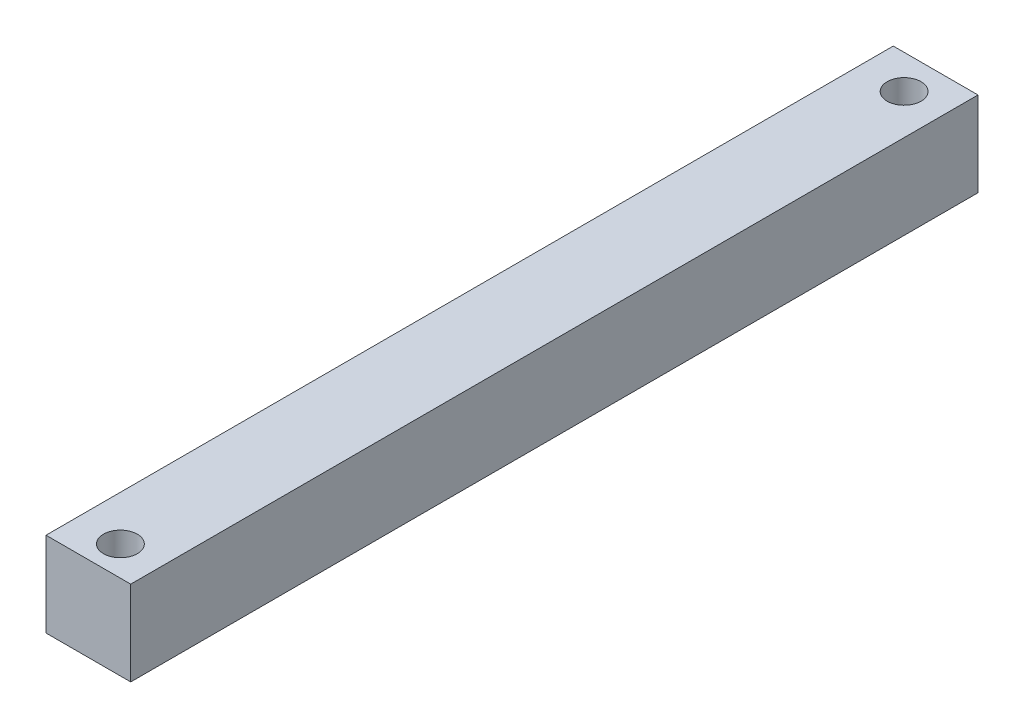
ISO-10303-21;
HEADER;
FILE_DESCRIPTION(('STEP AP214'),'2;1');
FILE_NAME('part.step','',(''),(''),'','','');
FILE_SCHEMA(('AUTOMOTIVE_DESIGN { 1 0 10303 214 1 1 1 1 }'));
ENDSEC;
DATA;
#1=APPLICATION_CONTEXT('core data for automotive mechanical design processes');
#2=APPLICATION_PROTOCOL_DEFINITION('international standard','automotive_design',2000,#1);
#3=PRODUCT_CONTEXT('',#1,'mechanical');
#4=PRODUCT('Part','Part','',(#3));
#5=PRODUCT_RELATED_PRODUCT_CATEGORY('part','',(#4));
#6=PRODUCT_DEFINITION_FORMATION('','',#4);
#7=PRODUCT_DEFINITION_CONTEXT('part definition',#1,'design');
#8=PRODUCT_DEFINITION('design','',#6,#7);
#9=PRODUCT_DEFINITION_SHAPE('','',#8);
#10=(LENGTH_UNIT() NAMED_UNIT(*) SI_UNIT(.MILLI.,.METRE.));
#11=(NAMED_UNIT(*) PLANE_ANGLE_UNIT() SI_UNIT($,.RADIAN.));
#12=(NAMED_UNIT(*) SI_UNIT($,.STERADIAN.) SOLID_ANGLE_UNIT());
#13=UNCERTAINTY_MEASURE_WITH_UNIT(LENGTH_MEASURE(1.E-05),#10,'distance_accuracy_value','');
#14=(GEOMETRIC_REPRESENTATION_CONTEXT(3) GLOBAL_UNCERTAINTY_ASSIGNED_CONTEXT((#13)) GLOBAL_UNIT_ASSIGNED_CONTEXT((#10,
#11,#12)) REPRESENTATION_CONTEXT('',''));
#15=CARTESIAN_POINT('',(0.,0.,0.));
#16=DIRECTION('',(0.,0.,1.));
#17=DIRECTION('',(1.,0.,0.));
#18=AXIS2_PLACEMENT_3D('',#15,#16,#17);
#19=CARTESIAN_POINT('',(-1.09957761847415,10.,-34.6601456924102));
#20=DIRECTION('',(1.,0.,0.));
#21=DIRECTION('',(0.,0.,-1.));
#22=AXIS2_PLACEMENT_3D('',#19,#20,#21);
#23=PLANE('',#22);
#24=DIRECTION('',(0.,0.,1.));
#25=VECTOR('',#24,1.);
#26=CARTESIAN_POINT('',(-1.09957761847415,0.,-34.6601456924102));
#27=LINE('',#26,#25);
#28=CARTESIAN_POINT('',(-1.09957761847415,0.,-34.6601456924102));
#29=VERTEX_POINT('',#28);
#30=CARTESIAN_POINT('',(-1.09957761847413,0.,65.3398543075898));
#31=VERTEX_POINT('',#30);
#32=EDGE_CURVE('E96',#29,#31,#27,.T.);
#33=ORIENTED_EDGE('',*,*,#32,.T.);
#34=DIRECTION('',(0.,-1.,0.));
#35=VECTOR('',#34,1.);
#36=CARTESIAN_POINT('',(-1.09957761847413,10.,65.3398543075898));
#37=LINE('',#36,#35);
#38=CARTESIAN_POINT('',(-1.09957761847413,10.,65.3398543075898));
#39=VERTEX_POINT('',#38);
#40=EDGE_CURVE('E11',#39,#31,#37,.T.);
#41=ORIENTED_EDGE('',*,*,#40,.F.);
#42=DIRECTION('',(0.,0.,1.));
#43=VECTOR('',#42,1.);
#44=CARTESIAN_POINT('',(-1.09957761847415,10.,-34.6601456924102));
#45=LINE('',#44,#43);
#46=CARTESIAN_POINT('',(-1.09957761847415,10.,-34.6601456924102));
#47=VERTEX_POINT('',#46);
#48=EDGE_CURVE('E84',#47,#39,#45,.T.);
#49=ORIENTED_EDGE('',*,*,#48,.F.);
#50=DIRECTION('',(0.,-1.,0.));
#51=VECTOR('',#50,1.);
#52=CARTESIAN_POINT('',(-1.09957761847415,10.,-34.6601456924102));
#53=LINE('',#52,#51);
#54=EDGE_CURVE('E92',#47,#29,#53,.T.);
#55=ORIENTED_EDGE('',*,*,#54,.T.);
#56=EDGE_LOOP('',(#33,#41,#49,#55));
#57=FACE_BOUND('',#56,.T.);
#58=ADVANCED_FACE('F33',(#57),#23,.F.);
#59=CARTESIAN_POINT('',(-1.09957761847413,10.,65.3398543075898));
#60=DIRECTION('',(0.,0.,-1.));
#61=DIRECTION('',(-1.,0.,0.));
#62=AXIS2_PLACEMENT_3D('',#59,#60,#61);
#63=PLANE('',#62);
#64=DIRECTION('',(1.,0.,0.));
#65=VECTOR('',#64,1.);
#66=CARTESIAN_POINT('',(-1.09957761847413,0.,65.3398543075898));
#67=LINE('',#66,#65);
#68=CARTESIAN_POINT('',(8.90042238152585,0.,65.3398543075898));
#69=VERTEX_POINT('',#68);
#70=EDGE_CURVE('E88',#31,#69,#67,.T.);
#71=ORIENTED_EDGE('',*,*,#70,.T.);
#72=DIRECTION('',(0.,-1.,0.));
#73=VECTOR('',#72,1.);
#74=CARTESIAN_POINT('',(8.90042238152585,10.,65.3398543075898));
#75=LINE('',#74,#73);
#76=CARTESIAN_POINT('',(8.90042238152585,10.,65.3398543075898));
#77=VERTEX_POINT('',#76);
#78=EDGE_CURVE('E41',#77,#69,#75,.T.);
#79=ORIENTED_EDGE('',*,*,#78,.F.);
#80=DIRECTION('',(1.,0.,0.));
#81=VECTOR('',#80,1.);
#82=CARTESIAN_POINT('',(-1.09957761847413,10.,65.3398543075898));
#83=LINE('',#82,#81);
#84=EDGE_CURVE('E79',#39,#77,#83,.T.);
#85=ORIENTED_EDGE('',*,*,#84,.F.);
#86=ORIENTED_EDGE('',*,*,#40,.T.);
#87=EDGE_LOOP('',(#71,#79,#85,#86));
#88=FACE_BOUND('',#87,.T.);
#89=ADVANCED_FACE('F87',(#88),#63,.F.);
#90=CARTESIAN_POINT('',(8.90042238152585,10.,-34.6601456924102));
#91=DIRECTION('',(-1.,0.,0.));
#92=DIRECTION('',(0.,0.,1.));
#93=AXIS2_PLACEMENT_3D('',#90,#91,#92);
#94=PLANE('',#93);
#95=DIRECTION('',(0.,0.,-1.));
#96=VECTOR('',#95,1.);
#97=CARTESIAN_POINT('',(8.90042238152585,0.,-34.6601456924102));
#98=LINE('',#97,#96);
#99=CARTESIAN_POINT('',(8.90042238152585,0.,-34.6601456924102));
#100=VERTEX_POINT('',#99);
#101=EDGE_CURVE('E66',#69,#100,#98,.T.);
#102=ORIENTED_EDGE('',*,*,#101,.T.);
#103=DIRECTION('',(0.,-1.,0.));
#104=VECTOR('',#103,1.);
#105=CARTESIAN_POINT('',(8.90042238152585,10.,-34.6601456924102));
#106=LINE('',#105,#104);
#107=CARTESIAN_POINT('',(8.90042238152585,10.,-34.6601456924102));
#108=VERTEX_POINT('',#107);
#109=EDGE_CURVE('E89',#108,#100,#106,.T.);
#110=ORIENTED_EDGE('',*,*,#109,.F.);
#111=DIRECTION('',(0.,0.,-1.));
#112=VECTOR('',#111,1.);
#113=CARTESIAN_POINT('',(8.90042238152585,10.,-34.6601456924102));
#114=LINE('',#113,#112);
#115=EDGE_CURVE('E82',#77,#108,#114,.T.);
#116=ORIENTED_EDGE('',*,*,#115,.F.);
#117=ORIENTED_EDGE('',*,*,#78,.T.);
#118=EDGE_LOOP('',(#102,#110,#116,#117));
#119=FACE_BOUND('',#118,.T.);
#120=ADVANCED_FACE('F90',(#119),#94,.F.);
#121=CARTESIAN_POINT('',(-1.09957761847415,10.,-34.6601456924102));
#122=DIRECTION('',(0.,0.,1.));
#123=DIRECTION('',(1.,0.,0.));
#124=AXIS2_PLACEMENT_3D('',#121,#122,#123);
#125=PLANE('',#124);
#126=DIRECTION('',(-1.,0.,0.));
#127=VECTOR('',#126,1.);
#128=CARTESIAN_POINT('',(-1.09957761847415,0.,-34.6601456924102));
#129=LINE('',#128,#127);
#130=EDGE_CURVE('E72',#100,#29,#129,.T.);
#131=ORIENTED_EDGE('',*,*,#130,.T.);
#132=ORIENTED_EDGE('',*,*,#54,.F.);
#133=DIRECTION('',(-1.,0.,0.));
#134=VECTOR('',#133,1.);
#135=CARTESIAN_POINT('',(-1.09957761847415,10.,-34.6601456924102));
#136=LINE('',#135,#134);
#137=EDGE_CURVE('E49',#108,#47,#136,.T.);
#138=ORIENTED_EDGE('',*,*,#137,.F.);
#139=ORIENTED_EDGE('',*,*,#109,.T.);
#140=EDGE_LOOP('',(#131,#132,#138,#139));
#141=FACE_BOUND('',#140,.T.);
#142=ADVANCED_FACE('F104',(#141),#125,.F.);
#143=CARTESIAN_POINT('',(0.,10.,0.));
#144=DIRECTION('',(0.,1.,0.));
#145=DIRECTION('',(0.,0.,1.));
#146=AXIS2_PLACEMENT_3D('',#143,#144,#145);
#147=PLANE('',#146);
#148=CARTESIAN_POINT('',(4.18133562493495,10.,61.8398543075898));
#149=DIRECTION('',(0.,1.,0.));
#150=DIRECTION('',(0.,0.,1.));
#151=AXIS2_PLACEMENT_3D('',#148,#149,#150);
#152=CIRCLE('',#151,2.);
#153=CARTESIAN_POINT('',(4.18133562493495,10.,63.8398543075898));
#154=VERTEX_POINT('',#153);
#155=EDGE_CURVE('E116',#154,#154,#152,.T.);
#156=ORIENTED_EDGE('',*,*,#155,.F.);
#157=EDGE_LOOP('',(#156));
#158=FACE_BOUND('',#157,.T.);
#159=CARTESIAN_POINT('',(4.18133562493495,10.,-30.6601456924102));
#160=DIRECTION('',(0.,1.,0.));
#161=DIRECTION('',(0.,0.,1.));
#162=AXIS2_PLACEMENT_3D('',#159,#160,#161);
#163=CIRCLE('',#162,2.);
#164=CARTESIAN_POINT('',(4.18133562493495,10.,-28.6601456924102));
#165=VERTEX_POINT('',#164);
#166=EDGE_CURVE('E110',#165,#165,#163,.T.);
#167=ORIENTED_EDGE('',*,*,#166,.F.);
#168=EDGE_LOOP('',(#167));
#169=FACE_BOUND('',#168,.T.);
#170=ORIENTED_EDGE('',*,*,#48,.T.);
#171=ORIENTED_EDGE('',*,*,#84,.T.);
#172=ORIENTED_EDGE('',*,*,#115,.T.);
#173=ORIENTED_EDGE('',*,*,#137,.T.);
#174=EDGE_LOOP('',(#170,#171,#172,#173));
#175=FACE_BOUND('',#174,.T.);
#176=ADVANCED_FACE('F80',(#158,#169,#175),#147,.T.);
#177=CARTESIAN_POINT('',(0.,0.,0.));
#178=DIRECTION('',(0.,1.,0.));
#179=DIRECTION('',(0.,0.,1.));
#180=AXIS2_PLACEMENT_3D('',#177,#178,#179);
#181=PLANE('',#180);
#182=CARTESIAN_POINT('',(4.18133562493495,0.,61.8398543075898));
#183=DIRECTION('',(0.,1.,0.));
#184=DIRECTION('',(0.,0.,1.));
#185=AXIS2_PLACEMENT_3D('',#182,#183,#184);
#186=CIRCLE('',#185,2.);
#187=CARTESIAN_POINT('',(4.18133562493495,0.,63.8398543075898));
#188=VERTEX_POINT('',#187);
#189=EDGE_CURVE('E113',#188,#188,#186,.T.);
#190=ORIENTED_EDGE('',*,*,#189,.T.);
#191=EDGE_LOOP('',(#190));
#192=FACE_BOUND('',#191,.T.);
#193=CARTESIAN_POINT('',(4.18133562493495,0.,-30.6601456924102));
#194=DIRECTION('',(0.,1.,0.));
#195=DIRECTION('',(0.,0.,1.));
#196=AXIS2_PLACEMENT_3D('',#193,#194,#195);
#197=CIRCLE('',#196,2.);
#198=CARTESIAN_POINT('',(4.18133562493495,0.,-28.6601456924102));
#199=VERTEX_POINT('',#198);
#200=EDGE_CURVE('E99',#199,#199,#197,.T.);
#201=ORIENTED_EDGE('',*,*,#200,.T.);
#202=EDGE_LOOP('',(#201));
#203=FACE_BOUND('',#202,.T.);
#204=ORIENTED_EDGE('',*,*,#32,.F.);
#205=ORIENTED_EDGE('',*,*,#130,.F.);
#206=ORIENTED_EDGE('',*,*,#101,.F.);
#207=ORIENTED_EDGE('',*,*,#70,.F.);
#208=EDGE_LOOP('',(#204,#205,#206,#207));
#209=FACE_BOUND('',#208,.T.);
#210=ADVANCED_FACE('F107',(#192,#203,#209),#181,.F.);
#211=CARTESIAN_POINT('',(4.18133562493495,0.,-30.6601456924102));
#212=DIRECTION('',(0.,1.,0.));
#213=DIRECTION('',(0.,0.,1.));
#214=AXIS2_PLACEMENT_3D('',#211,#212,#213);
#215=CYLINDRICAL_SURFACE('',#214,2.);
#216=ORIENTED_EDGE('',*,*,#200,.F.);
#217=EDGE_LOOP('',(#216));
#218=FACE_BOUND('',#217,.T.);
#219=ORIENTED_EDGE('',*,*,#166,.T.);
#220=EDGE_LOOP('',(#219));
#221=FACE_BOUND('',#220,.T.);
#222=ADVANCED_FACE('F127',(#218,#221),#215,.F.);
#223=CARTESIAN_POINT('',(4.18133562493495,0.,61.8398543075898));
#224=DIRECTION('',(0.,1.,0.));
#225=DIRECTION('',(0.,0.,1.));
#226=AXIS2_PLACEMENT_3D('',#223,#224,#225);
#227=CYLINDRICAL_SURFACE('',#226,2.);
#228=ORIENTED_EDGE('',*,*,#189,.F.);
#229=EDGE_LOOP('',(#228));
#230=FACE_BOUND('',#229,.T.);
#231=ORIENTED_EDGE('',*,*,#155,.T.);
#232=EDGE_LOOP('',(#231));
#233=FACE_BOUND('',#232,.T.);
#234=ADVANCED_FACE('F124',(#230,#233),#227,.F.);
#235=CLOSED_SHELL('',(#58,#89,#120,#142,#176,#210,#222,#234));
#236=MANIFOLD_SOLID_BREP('B2',#235);
#237=ADVANCED_BREP_SHAPE_REPRESENTATION('',(#18,#236),#14);
#238=SHAPE_DEFINITION_REPRESENTATION(#9,#237);
ENDSEC;
END-ISO-10303-21;
